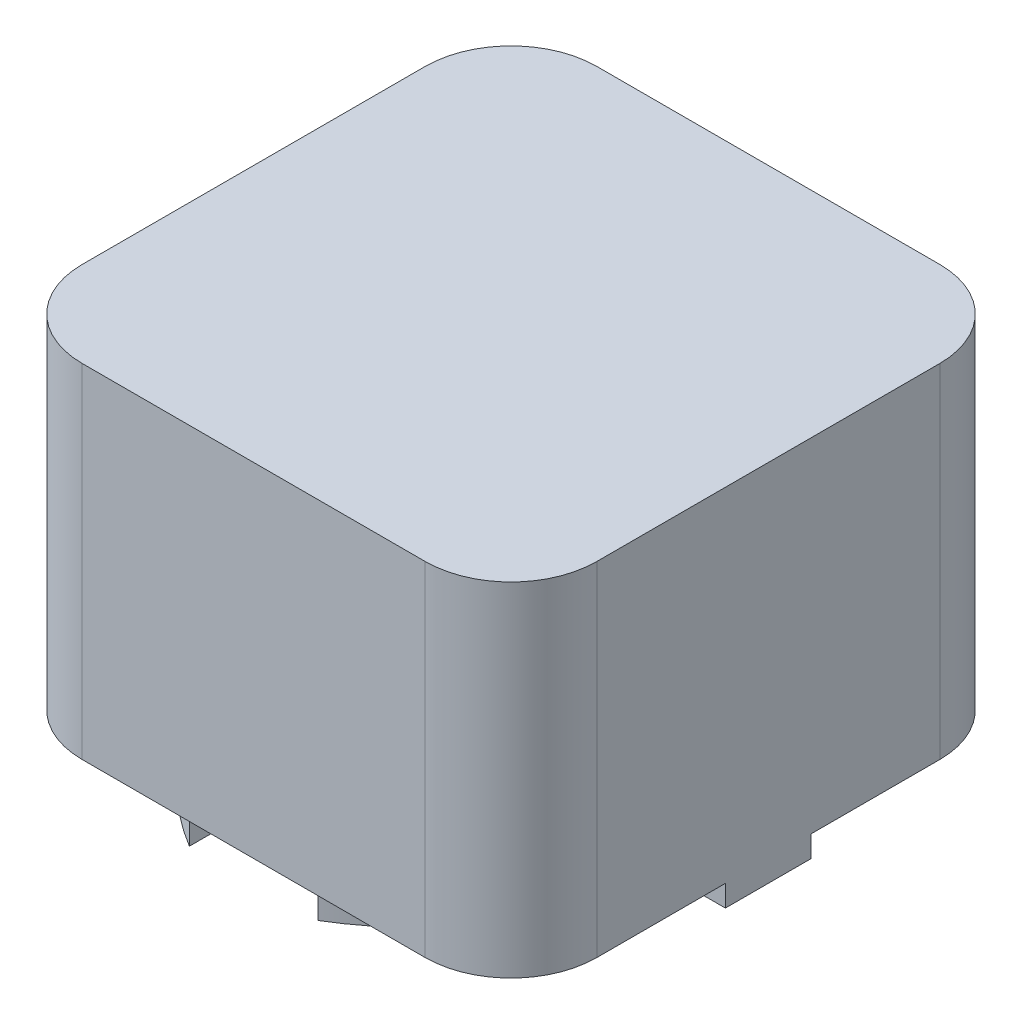
ISO-10303-21;
HEADER;
FILE_DESCRIPTION(('STEP AP214'),'2;1');
FILE_NAME('part.step','',(''),(''),'','','');
FILE_SCHEMA(('AUTOMOTIVE_DESIGN { 1 0 10303 214 1 1 1 1 }'));
ENDSEC;
DATA;
#1=APPLICATION_CONTEXT('core data for automotive mechanical design processes');
#2=APPLICATION_PROTOCOL_DEFINITION('international standard','automotive_design',2000,#1);
#3=PRODUCT_CONTEXT('',#1,'mechanical');
#4=PRODUCT('Part','Part','',(#3));
#5=PRODUCT_RELATED_PRODUCT_CATEGORY('part','',(#4));
#6=PRODUCT_DEFINITION_FORMATION('','',#4);
#7=PRODUCT_DEFINITION_CONTEXT('part definition',#1,'design');
#8=PRODUCT_DEFINITION('design','',#6,#7);
#9=PRODUCT_DEFINITION_SHAPE('','',#8);
#10=(LENGTH_UNIT() NAMED_UNIT(*) SI_UNIT(.MILLI.,.METRE.));
#11=(NAMED_UNIT(*) PLANE_ANGLE_UNIT() SI_UNIT($,.RADIAN.));
#12=(NAMED_UNIT(*) SI_UNIT($,.STERADIAN.) SOLID_ANGLE_UNIT());
#13=UNCERTAINTY_MEASURE_WITH_UNIT(LENGTH_MEASURE(1.E-05),#10,'distance_accuracy_value','');
#14=(GEOMETRIC_REPRESENTATION_CONTEXT(3) GLOBAL_UNCERTAINTY_ASSIGNED_CONTEXT((#13)) GLOBAL_UNIT_ASSIGNED_CONTEXT((#10,
#11,#12)) REPRESENTATION_CONTEXT('',''));
#15=CARTESIAN_POINT('',(0.,0.,0.));
#16=DIRECTION('',(0.,0.,1.));
#17=DIRECTION('',(1.,0.,0.));
#18=AXIS2_PLACEMENT_3D('',#15,#16,#17);
#19=CARTESIAN_POINT('',(0.,0.,0.));
#20=DIRECTION('',(0.,1.,0.));
#21=DIRECTION('',(0.,0.,1.));
#22=AXIS2_PLACEMENT_3D('',#19,#20,#21);
#23=PLANE('',#22);
#24=DIRECTION('',(-1.,0.,0.));
#25=VECTOR('',#24,1.);
#26=CARTESIAN_POINT('',(4.,0.,1.));
#27=LINE('',#26,#25);
#28=CARTESIAN_POINT('',(6.,0.,1.));
#29=VERTEX_POINT('',#28);
#30=CARTESIAN_POINT('',(4.82265195481152,0.,1.));
#31=VERTEX_POINT('',#30);
#32=EDGE_CURVE('E200',#29,#31,#27,.T.);
#33=ORIENTED_EDGE('',*,*,#32,.F.);
#34=DIRECTION('',(0.,0.,-1.));
#35=VECTOR('',#34,1.);
#36=CARTESIAN_POINT('',(6.,0.,-6.));
#37=LINE('',#36,#35);
#38=CARTESIAN_POINT('',(6.,0.,4.));
#39=VERTEX_POINT('',#38);
#40=EDGE_CURVE('E283',#39,#29,#37,.T.);
#41=ORIENTED_EDGE('',*,*,#40,.F.);
#42=CARTESIAN_POINT('',(4.,0.,4.));
#43=DIRECTION('',(0.,1.,0.));
#44=DIRECTION('',(0.,0.,1.));
#45=AXIS2_PLACEMENT_3D('',#42,#43,#44);
#46=CIRCLE('',#45,2.);
#47=CARTESIAN_POINT('',(4.,0.,6.));
#48=VERTEX_POINT('',#47);
#49=EDGE_CURVE('E301',#39,#48,#46,.F.);
#50=ORIENTED_EDGE('',*,*,#49,.T.);
#51=DIRECTION('',(1.,0.,0.));
#52=VECTOR('',#51,1.);
#53=CARTESIAN_POINT('',(-6.,0.,6.));
#54=LINE('',#53,#52);
#55=CARTESIAN_POINT('',(1.5,0.,6.));
#56=VERTEX_POINT('',#55);
#57=EDGE_CURVE('E278',#56,#48,#54,.T.);
#58=ORIENTED_EDGE('',*,*,#57,.F.);
#59=CARTESIAN_POINT('',(-2.10555127546399,0.,0.));
#60=DIRECTION('',(0.,-1.,0.));
#61=DIRECTION('',(0.,0.,1.));
#62=AXIS2_PLACEMENT_3D('',#59,#60,#61);
#63=CIRCLE('',#62,7.);
#64=EDGE_CURVE('E224',#31,#56,#63,.T.);
#65=ORIENTED_EDGE('',*,*,#64,.F.);
#66=EDGE_LOOP('',(#33,#41,#50,#58,#65));
#67=FACE_BOUND('',#66,.T.);
#68=ADVANCED_FACE('F37',(#67),#23,.F.);
#69=DIRECTION('',(1.,0.,0.));
#70=VECTOR('',#69,1.);
#71=CARTESIAN_POINT('',(4.,0.,-1.));
#72=LINE('',#71,#70);
#73=CARTESIAN_POINT('',(4.82265195481152,0.,-1.));
#74=VERTEX_POINT('',#73);
#75=CARTESIAN_POINT('',(6.,0.,-1.));
#76=VERTEX_POINT('',#75);
#77=EDGE_CURVE('E187',#74,#76,#72,.T.);
#78=ORIENTED_EDGE('',*,*,#77,.F.);
#79=CARTESIAN_POINT('',(1.5,0.,-6.));
#80=VERTEX_POINT('',#79);
#81=EDGE_CURVE('E230',#80,#74,#63,.T.);
#82=ORIENTED_EDGE('',*,*,#81,.F.);
#83=DIRECTION('',(-1.,0.,0.));
#84=VECTOR('',#83,1.);
#85=CARTESIAN_POINT('',(-6.,0.,-6.));
#86=LINE('',#85,#84);
#87=CARTESIAN_POINT('',(4.,0.,-6.));
#88=VERTEX_POINT('',#87);
#89=EDGE_CURVE('E265',#88,#80,#86,.T.);
#90=ORIENTED_EDGE('',*,*,#89,.F.);
#91=CARTESIAN_POINT('',(4.,0.,-4.));
#92=DIRECTION('',(0.,1.,0.));
#93=DIRECTION('',(0.,0.,1.));
#94=AXIS2_PLACEMENT_3D('',#91,#92,#93);
#95=CIRCLE('',#94,2.);
#96=CARTESIAN_POINT('',(6.,0.,-4.));
#97=VERTEX_POINT('',#96);
#98=EDGE_CURVE('E298',#88,#97,#95,.F.);
#99=ORIENTED_EDGE('',*,*,#98,.T.);
#100=EDGE_CURVE('E281',#76,#97,#37,.T.);
#101=ORIENTED_EDGE('',*,*,#100,.F.);
#102=EDGE_LOOP('',(#78,#82,#90,#99,#101));
#103=FACE_BOUND('',#102,.T.);
#104=ADVANCED_FACE('F375',(#103),#23,.F.);
#105=CARTESIAN_POINT('',(-2.10555127546399,-0.5,0.));
#106=DIRECTION('',(0.,1.,0.));
#107=DIRECTION('',(0.,0.,1.));
#108=AXIS2_PLACEMENT_3D('',#105,#106,#107);
#109=CYLINDRICAL_SURFACE('',#108,7.);
#110=DIRECTION('',(0.,1.,0.));
#111=VECTOR('',#110,1.);
#112=CARTESIAN_POINT('',(4.82265195481152,-0.5,1.));
#113=LINE('',#112,#111);
#114=CARTESIAN_POINT('',(4.82265195481152,-0.5,1.));
#115=VERTEX_POINT('',#114);
#116=EDGE_CURVE('E204',#31,#115,#113,.F.);
#117=ORIENTED_EDGE('',*,*,#116,.F.);
#118=ORIENTED_EDGE('',*,*,#64,.T.);
#119=DIRECTION('',(0.,1.,0.));
#120=VECTOR('',#119,1.);
#121=CARTESIAN_POINT('',(1.5,-0.5,6.));
#122=LINE('',#121,#120);
#123=CARTESIAN_POINT('',(1.5,-0.5,6.));
#124=VERTEX_POINT('',#123);
#125=EDGE_CURVE('E238',#124,#56,#122,.T.);
#126=ORIENTED_EDGE('',*,*,#125,.F.);
#127=CARTESIAN_POINT('',(-2.10555127546399,-0.5,0.));
#128=DIRECTION('',(0.,-1.,0.));
#129=DIRECTION('',(0.,0.,1.));
#130=AXIS2_PLACEMENT_3D('',#127,#128,#129);
#131=CIRCLE('',#130,7.);
#132=EDGE_CURVE('E227',#115,#124,#131,.T.);
#133=ORIENTED_EDGE('',*,*,#132,.F.);
#134=EDGE_LOOP('',(#117,#118,#126,#133));
#135=FACE_BOUND('',#134,.T.);
#136=ADVANCED_FACE('F385',(#135),#109,.T.);
#137=DIRECTION('',(0.,1.,0.));
#138=VECTOR('',#137,1.);
#139=CARTESIAN_POINT('',(4.82265195481152,-0.5,-1.));
#140=LINE('',#139,#138);
#141=CARTESIAN_POINT('',(4.82265195481152,-0.5,-1.));
#142=VERTEX_POINT('',#141);
#143=EDGE_CURVE('E190',#142,#74,#140,.T.);
#144=ORIENTED_EDGE('',*,*,#143,.F.);
#145=CARTESIAN_POINT('',(1.5,-0.5,-6.));
#146=VERTEX_POINT('',#145);
#147=EDGE_CURVE('E179',#146,#142,#131,.T.);
#148=ORIENTED_EDGE('',*,*,#147,.F.);
#149=DIRECTION('',(0.,1.,0.));
#150=VECTOR('',#149,1.);
#151=CARTESIAN_POINT('',(1.5,-0.5,-6.));
#152=LINE('',#151,#150);
#153=EDGE_CURVE('E229',#146,#80,#152,.T.);
#154=ORIENTED_EDGE('',*,*,#153,.T.);
#155=ORIENTED_EDGE('',*,*,#81,.T.);
#156=EDGE_LOOP('',(#144,#148,#154,#155));
#157=FACE_BOUND('',#156,.T.);
#158=ADVANCED_FACE('F382',(#157),#109,.T.);
#159=DIRECTION('',(1.,0.,0.));
#160=VECTOR('',#159,1.);
#161=CARTESIAN_POINT('',(-6.,0.,-1.));
#162=LINE('',#161,#160);
#163=CARTESIAN_POINT('',(-6.,0.,-1.));
#164=VERTEX_POINT('',#163);
#165=CARTESIAN_POINT('',(-4.82265195481152,0.,-1.));
#166=VERTEX_POINT('',#165);
#167=EDGE_CURVE('E206',#164,#166,#162,.T.);
#168=ORIENTED_EDGE('',*,*,#167,.F.);
#169=DIRECTION('',(0.,0.,1.));
#170=VECTOR('',#169,1.);
#171=CARTESIAN_POINT('',(-6.,0.,-6.));
#172=LINE('',#171,#170);
#173=CARTESIAN_POINT('',(-6.,0.,-4.));
#174=VERTEX_POINT('',#173);
#175=EDGE_CURVE('E275',#174,#164,#172,.T.);
#176=ORIENTED_EDGE('',*,*,#175,.F.);
#177=CARTESIAN_POINT('',(-4.,0.,-4.));
#178=DIRECTION('',(0.,1.,0.));
#179=DIRECTION('',(0.,0.,1.));
#180=AXIS2_PLACEMENT_3D('',#177,#178,#179);
#181=CIRCLE('',#180,2.);
#182=CARTESIAN_POINT('',(-4.,0.,-6.));
#183=VERTEX_POINT('',#182);
#184=EDGE_CURVE('E295',#174,#183,#181,.F.);
#185=ORIENTED_EDGE('',*,*,#184,.T.);
#186=CARTESIAN_POINT('',(-1.5,0.,-6.));
#187=VERTEX_POINT('',#186);
#188=EDGE_CURVE('E285',#187,#183,#86,.T.);
#189=ORIENTED_EDGE('',*,*,#188,.F.);
#190=CARTESIAN_POINT('',(2.10555127546399,0.,0.));
#191=DIRECTION('',(0.,-1.,0.));
#192=DIRECTION('',(0.,0.,1.));
#193=AXIS2_PLACEMENT_3D('',#190,#191,#192);
#194=CIRCLE('',#193,7.);
#195=EDGE_CURVE('E241',#166,#187,#194,.T.);
#196=ORIENTED_EDGE('',*,*,#195,.F.);
#197=EDGE_LOOP('',(#168,#176,#185,#189,#196));
#198=FACE_BOUND('',#197,.T.);
#199=ADVANCED_FACE('F384',(#198),#23,.F.);
#200=DIRECTION('',(-1.,0.,0.));
#201=VECTOR('',#200,1.);
#202=CARTESIAN_POINT('',(-6.,0.,1.));
#203=LINE('',#202,#201);
#204=CARTESIAN_POINT('',(-4.82265195481152,0.,1.));
#205=VERTEX_POINT('',#204);
#206=CARTESIAN_POINT('',(-6.,0.,1.));
#207=VERTEX_POINT('',#206);
#208=EDGE_CURVE('E209',#205,#207,#203,.T.);
#209=ORIENTED_EDGE('',*,*,#208,.F.);
#210=CARTESIAN_POINT('',(-1.5,0.,6.));
#211=VERTEX_POINT('',#210);
#212=EDGE_CURVE('E249',#211,#205,#194,.T.);
#213=ORIENTED_EDGE('',*,*,#212,.F.);
#214=CARTESIAN_POINT('',(-4.,0.,6.));
#215=VERTEX_POINT('',#214);
#216=EDGE_CURVE('E279',#215,#211,#54,.T.);
#217=ORIENTED_EDGE('',*,*,#216,.F.);
#218=CARTESIAN_POINT('',(-4.,0.,4.));
#219=DIRECTION('',(0.,1.,0.));
#220=DIRECTION('',(0.,0.,1.));
#221=AXIS2_PLACEMENT_3D('',#218,#219,#220);
#222=CIRCLE('',#221,2.);
#223=CARTESIAN_POINT('',(-6.,0.,4.));
#224=VERTEX_POINT('',#223);
#225=EDGE_CURVE('E292',#215,#224,#222,.F.);
#226=ORIENTED_EDGE('',*,*,#225,.T.);
#227=EDGE_CURVE('E260',#207,#224,#172,.T.);
#228=ORIENTED_EDGE('',*,*,#227,.F.);
#229=EDGE_LOOP('',(#209,#213,#217,#226,#228));
#230=FACE_BOUND('',#229,.T.);
#231=ADVANCED_FACE('F342',(#230),#23,.F.);
#232=CARTESIAN_POINT('',(2.10555127546399,-0.5,0.));
#233=DIRECTION('',(0.,1.,0.));
#234=DIRECTION('',(0.,0.,1.));
#235=AXIS2_PLACEMENT_3D('',#232,#233,#234);
#236=CYLINDRICAL_SURFACE('',#235,7.);
#237=DIRECTION('',(0.,1.,0.));
#238=VECTOR('',#237,1.);
#239=CARTESIAN_POINT('',(-4.82265195481152,-0.5,-1.));
#240=LINE('',#239,#238);
#241=CARTESIAN_POINT('',(-4.82265195481152,-0.5,-1.));
#242=VERTEX_POINT('',#241);
#243=EDGE_CURVE('E222',#166,#242,#240,.F.);
#244=ORIENTED_EDGE('',*,*,#243,.F.);
#245=ORIENTED_EDGE('',*,*,#195,.T.);
#246=DIRECTION('',(0.,1.,0.));
#247=VECTOR('',#246,1.);
#248=CARTESIAN_POINT('',(-1.5,-0.5,-6.));
#249=LINE('',#248,#247);
#250=CARTESIAN_POINT('',(-1.5,-0.5,-6.));
#251=VERTEX_POINT('',#250);
#252=EDGE_CURVE('E257',#251,#187,#249,.T.);
#253=ORIENTED_EDGE('',*,*,#252,.F.);
#254=CARTESIAN_POINT('',(2.10555127546399,-0.5,0.));
#255=DIRECTION('',(0.,-1.,0.));
#256=DIRECTION('',(0.,0.,1.));
#257=AXIS2_PLACEMENT_3D('',#254,#255,#256);
#258=CIRCLE('',#257,7.);
#259=EDGE_CURVE('E246',#242,#251,#258,.T.);
#260=ORIENTED_EDGE('',*,*,#259,.F.);
#261=EDGE_LOOP('',(#244,#245,#253,#260));
#262=FACE_BOUND('',#261,.T.);
#263=ADVANCED_FACE('F361',(#262),#236,.T.);
#264=DIRECTION('',(0.,1.,0.));
#265=VECTOR('',#264,1.);
#266=CARTESIAN_POINT('',(-4.82265195481152,-0.5,1.));
#267=LINE('',#266,#265);
#268=CARTESIAN_POINT('',(-4.82265195481152,-0.5,1.));
#269=VERTEX_POINT('',#268);
#270=EDGE_CURVE('E220',#269,#205,#267,.T.);
#271=ORIENTED_EDGE('',*,*,#270,.F.);
#272=CARTESIAN_POINT('',(-1.5,-0.5,6.));
#273=VERTEX_POINT('',#272);
#274=EDGE_CURVE('E242',#273,#269,#258,.T.);
#275=ORIENTED_EDGE('',*,*,#274,.F.);
#276=DIRECTION('',(0.,1.,0.));
#277=VECTOR('',#276,1.);
#278=CARTESIAN_POINT('',(-1.5,-0.5,6.));
#279=LINE('',#278,#277);
#280=EDGE_CURVE('E248',#273,#211,#279,.T.);
#281=ORIENTED_EDGE('',*,*,#280,.T.);
#282=ORIENTED_EDGE('',*,*,#212,.T.);
#283=EDGE_LOOP('',(#271,#275,#281,#282));
#284=FACE_BOUND('',#283,.T.);
#285=ADVANCED_FACE('F355',(#284),#236,.T.);
#286=DIRECTION('',(0.,0.,-1.));
#287=VECTOR('',#286,1.);
#288=CARTESIAN_POINT('',(1.5,0.,6.));
#289=LINE('',#288,#287);
#290=EDGE_CURVE('E233',#56,#80,#289,.T.);
#291=ORIENTED_EDGE('',*,*,#290,.F.);
#292=EDGE_CURVE('E282',#211,#56,#54,.T.);
#293=ORIENTED_EDGE('',*,*,#292,.F.);
#294=DIRECTION('',(0.,0.,1.));
#295=VECTOR('',#294,1.);
#296=CARTESIAN_POINT('',(-1.5,0.,6.));
#297=LINE('',#296,#295);
#298=EDGE_CURVE('E252',#187,#211,#297,.T.);
#299=ORIENTED_EDGE('',*,*,#298,.F.);
#300=EDGE_CURVE('E287',#80,#187,#86,.T.);
#301=ORIENTED_EDGE('',*,*,#300,.F.);
#302=EDGE_LOOP('',(#291,#293,#299,#301));
#303=FACE_BOUND('',#302,.T.);
#304=ADVANCED_FACE('F372',(#303),#23,.F.);
#305=CARTESIAN_POINT('',(-6.,8.,-6.));
#306=DIRECTION('',(1.,0.,0.));
#307=DIRECTION('',(0.,0.,-1.));
#308=AXIS2_PLACEMENT_3D('',#305,#306,#307);
#309=PLANE('',#308);
#310=DIRECTION('',(0.,0.,1.));
#311=VECTOR('',#310,1.);
#312=CARTESIAN_POINT('',(-6.,8.,-6.));
#313=LINE('',#312,#311);
#314=CARTESIAN_POINT('',(-6.,8.,-4.));
#315=VERTEX_POINT('',#314);
#316=CARTESIAN_POINT('',(-6.,8.,4.));
#317=VERTEX_POINT('',#316);
#318=EDGE_CURVE('E261',#315,#317,#313,.T.);
#319=ORIENTED_EDGE('',*,*,#318,.F.);
#320=DIRECTION('',(0.,-1.,0.));
#321=VECTOR('',#320,1.);
#322=CARTESIAN_POINT('',(-6.,8.,-4.));
#323=LINE('',#322,#321);
#324=EDGE_CURVE('E11',#315,#174,#323,.T.);
#325=ORIENTED_EDGE('',*,*,#324,.T.);
#326=ORIENTED_EDGE('',*,*,#175,.T.);
#327=DIRECTION('',(0.,1.,0.));
#328=VECTOR('',#327,1.);
#329=CARTESIAN_POINT('',(-6.,-0.5,-1.));
#330=LINE('',#329,#328);
#331=CARTESIAN_POINT('',(-6.,-0.5,-1.));
#332=VERTEX_POINT('',#331);
#333=EDGE_CURVE('E218',#332,#164,#330,.T.);
#334=ORIENTED_EDGE('',*,*,#333,.F.);
#335=DIRECTION('',(0.,0.,-1.));
#336=VECTOR('',#335,1.);
#337=CARTESIAN_POINT('',(-6.,-0.5,1.));
#338=LINE('',#337,#336);
#339=CARTESIAN_POINT('',(-6.,-0.5,1.));
#340=VERTEX_POINT('',#339);
#341=EDGE_CURVE('E207',#340,#332,#338,.T.);
#342=ORIENTED_EDGE('',*,*,#341,.F.);
#343=DIRECTION('',(0.,1.,0.));
#344=VECTOR('',#343,1.);
#345=CARTESIAN_POINT('',(-6.,-0.5,1.));
#346=LINE('',#345,#344);
#347=EDGE_CURVE('E213',#340,#207,#346,.T.);
#348=ORIENTED_EDGE('',*,*,#347,.T.);
#349=ORIENTED_EDGE('',*,*,#227,.T.);
#350=DIRECTION('',(0.,-1.,0.));
#351=VECTOR('',#350,1.);
#352=CARTESIAN_POINT('',(-6.,8.,4.));
#353=LINE('',#352,#351);
#354=EDGE_CURVE('E45',#224,#317,#353,.F.);
#355=ORIENTED_EDGE('',*,*,#354,.T.);
#356=EDGE_LOOP('',(#319,#325,#326,#334,#342,#348,#349,#355));
#357=FACE_BOUND('',#356,.T.);
#358=ADVANCED_FACE('F324',(#357),#309,.F.);
#359=CARTESIAN_POINT('',(-6.,8.,6.));
#360=DIRECTION('',(0.,0.,-1.));
#361=DIRECTION('',(-1.,0.,0.));
#362=AXIS2_PLACEMENT_3D('',#359,#360,#361);
#363=PLANE('',#362);
#364=ORIENTED_EDGE('',*,*,#216,.T.);
#365=ORIENTED_EDGE('',*,*,#292,.T.);
#366=ORIENTED_EDGE('',*,*,#57,.T.);
#367=DIRECTION('',(0.,-1.,0.));
#368=VECTOR('',#367,1.);
#369=CARTESIAN_POINT('',(4.,8.,6.));
#370=LINE('',#369,#368);
#371=CARTESIAN_POINT('',(4.,8.,6.));
#372=VERTEX_POINT('',#371);
#373=EDGE_CURVE('E307',#48,#372,#370,.F.);
#374=ORIENTED_EDGE('',*,*,#373,.T.);
#375=DIRECTION('',(1.,0.,0.));
#376=VECTOR('',#375,1.);
#377=CARTESIAN_POINT('',(-6.,8.,6.));
#378=LINE('',#377,#376);
#379=CARTESIAN_POINT('',(-4.,8.,6.));
#380=VERTEX_POINT('',#379);
#381=EDGE_CURVE('E264',#380,#372,#378,.T.);
#382=ORIENTED_EDGE('',*,*,#381,.F.);
#383=DIRECTION('',(0.,-1.,0.));
#384=VECTOR('',#383,1.);
#385=CARTESIAN_POINT('',(-4.,8.,6.));
#386=LINE('',#385,#384);
#387=EDGE_CURVE('E304',#380,#215,#386,.T.);
#388=ORIENTED_EDGE('',*,*,#387,.T.);
#389=EDGE_LOOP('',(#364,#365,#366,#374,#382,#388));
#390=FACE_BOUND('',#389,.T.);
#391=ADVANCED_FACE('F336',(#390),#363,.F.);
#392=CARTESIAN_POINT('',(6.,8.,-6.));
#393=DIRECTION('',(-1.,0.,0.));
#394=DIRECTION('',(0.,0.,1.));
#395=AXIS2_PLACEMENT_3D('',#392,#393,#394);
#396=PLANE('',#395);
#397=DIRECTION('',(0.,0.,-1.));
#398=VECTOR('',#397,1.);
#399=CARTESIAN_POINT('',(6.,8.,-6.));
#400=LINE('',#399,#398);
#401=CARTESIAN_POINT('',(6.,8.,4.));
#402=VERTEX_POINT('',#401);
#403=CARTESIAN_POINT('',(6.,8.,-4.));
#404=VERTEX_POINT('',#403);
#405=EDGE_CURVE('E268',#402,#404,#400,.T.);
#406=ORIENTED_EDGE('',*,*,#405,.F.);
#407=DIRECTION('',(0.,-1.,0.));
#408=VECTOR('',#407,1.);
#409=CARTESIAN_POINT('',(6.,8.,4.));
#410=LINE('',#409,#408);
#411=EDGE_CURVE('E289',#402,#39,#410,.T.);
#412=ORIENTED_EDGE('',*,*,#411,.T.);
#413=ORIENTED_EDGE('',*,*,#40,.T.);
#414=DIRECTION('',(0.,1.,0.));
#415=VECTOR('',#414,1.);
#416=CARTESIAN_POINT('',(6.,-0.5,1.));
#417=LINE('',#416,#415);
#418=CARTESIAN_POINT('',(6.,-0.5,1.));
#419=VERTEX_POINT('',#418);
#420=EDGE_CURVE('E191',#419,#29,#417,.T.);
#421=ORIENTED_EDGE('',*,*,#420,.F.);
#422=DIRECTION('',(0.,0.,1.));
#423=VECTOR('',#422,1.);
#424=CARTESIAN_POINT('',(6.,-0.5,1.));
#425=LINE('',#424,#423);
#426=CARTESIAN_POINT('',(6.,-0.5,-1.));
#427=VERTEX_POINT('',#426);
#428=EDGE_CURVE('E176',#427,#419,#425,.T.);
#429=ORIENTED_EDGE('',*,*,#428,.F.);
#430=DIRECTION('',(0.,1.,0.));
#431=VECTOR('',#430,1.);
#432=CARTESIAN_POINT('',(6.,-0.5,-1.));
#433=LINE('',#432,#431);
#434=EDGE_CURVE('E184',#427,#76,#433,.T.);
#435=ORIENTED_EDGE('',*,*,#434,.T.);
#436=ORIENTED_EDGE('',*,*,#100,.T.);
#437=DIRECTION('',(0.,-1.,0.));
#438=VECTOR('',#437,1.);
#439=CARTESIAN_POINT('',(6.,8.,-4.));
#440=LINE('',#439,#438);
#441=EDGE_CURVE('E274',#97,#404,#440,.F.);
#442=ORIENTED_EDGE('',*,*,#441,.T.);
#443=EDGE_LOOP('',(#406,#412,#413,#421,#429,#435,#436,#442));
#444=FACE_BOUND('',#443,.T.);
#445=ADVANCED_FACE('F194',(#444),#396,.F.);
#446=CARTESIAN_POINT('',(-6.,8.,-6.));
#447=DIRECTION('',(0.,0.,1.));
#448=DIRECTION('',(1.,0.,0.));
#449=AXIS2_PLACEMENT_3D('',#446,#447,#448);
#450=PLANE('',#449);
#451=DIRECTION('',(-1.,0.,0.));
#452=VECTOR('',#451,1.);
#453=CARTESIAN_POINT('',(-6.,8.,-6.));
#454=LINE('',#453,#452);
#455=CARTESIAN_POINT('',(4.,8.,-6.));
#456=VERTEX_POINT('',#455);
#457=CARTESIAN_POINT('',(-4.,8.,-6.));
#458=VERTEX_POINT('',#457);
#459=EDGE_CURVE('E271',#456,#458,#454,.T.);
#460=ORIENTED_EDGE('',*,*,#459,.F.);
#461=DIRECTION('',(0.,-1.,0.));
#462=VECTOR('',#461,1.);
#463=CARTESIAN_POINT('',(4.,8.,-6.));
#464=LINE('',#463,#462);
#465=EDGE_CURVE('E319',#456,#88,#464,.T.);
#466=ORIENTED_EDGE('',*,*,#465,.T.);
#467=ORIENTED_EDGE('',*,*,#89,.T.);
#468=ORIENTED_EDGE('',*,*,#300,.T.);
#469=ORIENTED_EDGE('',*,*,#188,.T.);
#470=DIRECTION('',(0.,-1.,0.));
#471=VECTOR('',#470,1.);
#472=CARTESIAN_POINT('',(-4.,8.,-6.));
#473=LINE('',#472,#471);
#474=EDGE_CURVE('E317',#183,#458,#473,.F.);
#475=ORIENTED_EDGE('',*,*,#474,.T.);
#476=EDGE_LOOP('',(#460,#466,#467,#468,#469,#475));
#477=FACE_BOUND('',#476,.T.);
#478=ADVANCED_FACE('F368',(#477),#450,.F.);
#479=CARTESIAN_POINT('',(0.,8.,0.));
#480=DIRECTION('',(0.,1.,0.));
#481=DIRECTION('',(0.,0.,1.));
#482=AXIS2_PLACEMENT_3D('',#479,#480,#481);
#483=PLANE('',#482);
#484=ORIENTED_EDGE('',*,*,#381,.T.);
#485=CARTESIAN_POINT('',(4.,8.,4.));
#486=DIRECTION('',(0.,1.,0.));
#487=DIRECTION('',(0.,0.,1.));
#488=AXIS2_PLACEMENT_3D('',#485,#486,#487);
#489=CIRCLE('',#488,2.);
#490=EDGE_CURVE('E315',#372,#402,#489,.T.);
#491=ORIENTED_EDGE('',*,*,#490,.T.);
#492=ORIENTED_EDGE('',*,*,#405,.T.);
#493=CARTESIAN_POINT('',(4.,8.,-4.));
#494=DIRECTION('',(0.,1.,0.));
#495=DIRECTION('',(0.,0.,1.));
#496=AXIS2_PLACEMENT_3D('',#493,#494,#495);
#497=CIRCLE('',#496,2.);
#498=EDGE_CURVE('E313',#404,#456,#497,.T.);
#499=ORIENTED_EDGE('',*,*,#498,.T.);
#500=ORIENTED_EDGE('',*,*,#459,.T.);
#501=CARTESIAN_POINT('',(-4.,8.,-4.));
#502=DIRECTION('',(0.,1.,0.));
#503=DIRECTION('',(0.,0.,1.));
#504=AXIS2_PLACEMENT_3D('',#501,#502,#503);
#505=CIRCLE('',#504,2.);
#506=EDGE_CURVE('E311',#458,#315,#505,.T.);
#507=ORIENTED_EDGE('',*,*,#506,.T.);
#508=ORIENTED_EDGE('',*,*,#318,.T.);
#509=CARTESIAN_POINT('',(-4.,8.,4.));
#510=DIRECTION('',(0.,1.,0.));
#511=DIRECTION('',(0.,0.,1.));
#512=AXIS2_PLACEMENT_3D('',#509,#510,#511);
#513=CIRCLE('',#512,2.);
#514=EDGE_CURVE('E309',#317,#380,#513,.T.);
#515=ORIENTED_EDGE('',*,*,#514,.T.);
#516=EDGE_LOOP('',(#484,#491,#492,#499,#500,#507,#508,#515));
#517=FACE_BOUND('',#516,.T.);
#518=ADVANCED_FACE('F330',(#517),#483,.T.);
#519=CARTESIAN_POINT('',(4.,8.,4.));
#520=DIRECTION('',(0.,-1.,0.));
#521=DIRECTION('',(0.,0.,-1.));
#522=AXIS2_PLACEMENT_3D('',#519,#520,#521);
#523=CYLINDRICAL_SURFACE('',#522,2.);
#524=ORIENTED_EDGE('',*,*,#490,.F.);
#525=ORIENTED_EDGE('',*,*,#373,.F.);
#526=ORIENTED_EDGE('',*,*,#49,.F.);
#527=ORIENTED_EDGE('',*,*,#411,.F.);
#528=EDGE_LOOP('',(#524,#525,#526,#527));
#529=FACE_BOUND('',#528,.T.);
#530=ADVANCED_FACE('F412',(#529),#523,.T.);
#531=CARTESIAN_POINT('',(4.,8.,-4.));
#532=DIRECTION('',(0.,-1.,0.));
#533=DIRECTION('',(0.,0.,-1.));
#534=AXIS2_PLACEMENT_3D('',#531,#532,#533);
#535=CYLINDRICAL_SURFACE('',#534,2.);
#536=ORIENTED_EDGE('',*,*,#498,.F.);
#537=ORIENTED_EDGE('',*,*,#441,.F.);
#538=ORIENTED_EDGE('',*,*,#98,.F.);
#539=ORIENTED_EDGE('',*,*,#465,.F.);
#540=EDGE_LOOP('',(#536,#537,#538,#539));
#541=FACE_BOUND('',#540,.T.);
#542=ADVANCED_FACE('F415',(#541),#535,.T.);
#543=CARTESIAN_POINT('',(-4.,8.,-4.));
#544=DIRECTION('',(0.,-1.,0.));
#545=DIRECTION('',(0.,0.,-1.));
#546=AXIS2_PLACEMENT_3D('',#543,#544,#545);
#547=CYLINDRICAL_SURFACE('',#546,2.);
#548=ORIENTED_EDGE('',*,*,#506,.F.);
#549=ORIENTED_EDGE('',*,*,#474,.F.);
#550=ORIENTED_EDGE('',*,*,#184,.F.);
#551=ORIENTED_EDGE('',*,*,#324,.F.);
#552=EDGE_LOOP('',(#548,#549,#550,#551));
#553=FACE_BOUND('',#552,.T.);
#554=ADVANCED_FACE('F418',(#553),#547,.T.);
#555=CARTESIAN_POINT('',(-4.,8.,4.));
#556=DIRECTION('',(0.,-1.,0.));
#557=DIRECTION('',(0.,0.,-1.));
#558=AXIS2_PLACEMENT_3D('',#555,#556,#557);
#559=CYLINDRICAL_SURFACE('',#558,2.);
#560=ORIENTED_EDGE('',*,*,#514,.F.);
#561=ORIENTED_EDGE('',*,*,#354,.F.);
#562=ORIENTED_EDGE('',*,*,#225,.F.);
#563=ORIENTED_EDGE('',*,*,#387,.F.);
#564=EDGE_LOOP('',(#560,#561,#562,#563));
#565=FACE_BOUND('',#564,.T.);
#566=ADVANCED_FACE('F39',(#565),#559,.T.);
#567=CARTESIAN_POINT('',(-1.5,-0.5,6.));
#568=DIRECTION('',(-1.,0.,0.));
#569=DIRECTION('',(0.,0.,1.));
#570=AXIS2_PLACEMENT_3D('',#567,#568,#569);
#571=PLANE('',#570);
#572=ORIENTED_EDGE('',*,*,#298,.T.);
#573=ORIENTED_EDGE('',*,*,#280,.F.);
#574=DIRECTION('',(0.,0.,1.));
#575=VECTOR('',#574,1.);
#576=CARTESIAN_POINT('',(-1.5,-0.5,6.));
#577=LINE('',#576,#575);
#578=EDGE_CURVE('E245',#251,#273,#577,.T.);
#579=ORIENTED_EDGE('',*,*,#578,.F.);
#580=ORIENTED_EDGE('',*,*,#252,.T.);
#581=EDGE_LOOP('',(#572,#573,#579,#580));
#582=FACE_BOUND('',#581,.T.);
#583=ADVANCED_FACE('F348',(#582),#571,.F.);
#584=CARTESIAN_POINT('',(2.10555127546399,-0.5,0.));
#585=DIRECTION('',(0.,1.,0.));
#586=DIRECTION('',(0.,0.,1.));
#587=AXIS2_PLACEMENT_3D('',#584,#585,#586);
#588=PLANE('',#587);
#589=ORIENTED_EDGE('',*,*,#274,.T.);
#590=DIRECTION('',(-1.,0.,0.));
#591=VECTOR('',#590,1.);
#592=CARTESIAN_POINT('',(-6.,-0.5,1.));
#593=LINE('',#592,#591);
#594=EDGE_CURVE('E211',#269,#340,#593,.T.);
#595=ORIENTED_EDGE('',*,*,#594,.T.);
#596=ORIENTED_EDGE('',*,*,#341,.T.);
#597=DIRECTION('',(1.,0.,0.));
#598=VECTOR('',#597,1.);
#599=CARTESIAN_POINT('',(-6.,-0.5,-1.));
#600=LINE('',#599,#598);
#601=EDGE_CURVE('E60',#332,#242,#600,.T.);
#602=ORIENTED_EDGE('',*,*,#601,.T.);
#603=ORIENTED_EDGE('',*,*,#259,.T.);
#604=ORIENTED_EDGE('',*,*,#578,.T.);
#605=EDGE_LOOP('',(#589,#595,#596,#602,#603,#604));
#606=FACE_BOUND('',#605,.T.);
#607=ADVANCED_FACE('F356',(#606),#588,.F.);
#608=CARTESIAN_POINT('',(1.5,-0.5,6.));
#609=DIRECTION('',(1.,0.,0.));
#610=DIRECTION('',(0.,0.,-1.));
#611=AXIS2_PLACEMENT_3D('',#608,#609,#610);
#612=PLANE('',#611);
#613=ORIENTED_EDGE('',*,*,#290,.T.);
#614=ORIENTED_EDGE('',*,*,#153,.F.);
#615=DIRECTION('',(0.,0.,-1.));
#616=VECTOR('',#615,1.);
#617=CARTESIAN_POINT('',(1.5,-0.5,6.));
#618=LINE('',#617,#616);
#619=EDGE_CURVE('E226',#124,#146,#618,.T.);
#620=ORIENTED_EDGE('',*,*,#619,.F.);
#621=ORIENTED_EDGE('',*,*,#125,.T.);
#622=EDGE_LOOP('',(#613,#614,#620,#621));
#623=FACE_BOUND('',#622,.T.);
#624=ADVANCED_FACE('F379',(#623),#612,.F.);
#625=CARTESIAN_POINT('',(-2.10555127546399,-0.5,0.));
#626=DIRECTION('',(0.,1.,0.));
#627=DIRECTION('',(0.,0.,1.));
#628=AXIS2_PLACEMENT_3D('',#625,#626,#627);
#629=PLANE('',#628);
#630=ORIENTED_EDGE('',*,*,#147,.T.);
#631=DIRECTION('',(1.,0.,0.));
#632=VECTOR('',#631,1.);
#633=CARTESIAN_POINT('',(4.,-0.5,-1.));
#634=LINE('',#633,#632);
#635=EDGE_CURVE('E172',#142,#427,#634,.T.);
#636=ORIENTED_EDGE('',*,*,#635,.T.);
#637=ORIENTED_EDGE('',*,*,#428,.T.);
#638=DIRECTION('',(-1.,0.,0.));
#639=VECTOR('',#638,1.);
#640=CARTESIAN_POINT('',(4.,-0.5,1.));
#641=LINE('',#640,#639);
#642=EDGE_CURVE('E52',#419,#115,#641,.T.);
#643=ORIENTED_EDGE('',*,*,#642,.T.);
#644=ORIENTED_EDGE('',*,*,#132,.T.);
#645=ORIENTED_EDGE('',*,*,#619,.T.);
#646=EDGE_LOOP('',(#630,#636,#637,#643,#644,#645));
#647=FACE_BOUND('',#646,.T.);
#648=ADVANCED_FACE('F174',(#647),#629,.F.);
#649=CARTESIAN_POINT('',(-6.,-0.5,-1.));
#650=DIRECTION('',(0.,0.,1.));
#651=DIRECTION('',(1.,0.,0.));
#652=AXIS2_PLACEMENT_3D('',#649,#650,#651);
#653=PLANE('',#652);
#654=ORIENTED_EDGE('',*,*,#167,.T.);
#655=ORIENTED_EDGE('',*,*,#243,.T.);
#656=ORIENTED_EDGE('',*,*,#601,.F.);
#657=ORIENTED_EDGE('',*,*,#333,.T.);
#658=EDGE_LOOP('',(#654,#655,#656,#657));
#659=FACE_BOUND('',#658,.T.);
#660=ADVANCED_FACE('F429',(#659),#653,.F.);
#661=CARTESIAN_POINT('',(-6.,-0.5,1.));
#662=DIRECTION('',(0.,0.,-1.));
#663=DIRECTION('',(-1.,0.,0.));
#664=AXIS2_PLACEMENT_3D('',#661,#662,#663);
#665=PLANE('',#664);
#666=ORIENTED_EDGE('',*,*,#594,.F.);
#667=ORIENTED_EDGE('',*,*,#270,.T.);
#668=ORIENTED_EDGE('',*,*,#208,.T.);
#669=ORIENTED_EDGE('',*,*,#347,.F.);
#670=EDGE_LOOP('',(#666,#667,#668,#669));
#671=FACE_BOUND('',#670,.T.);
#672=ADVANCED_FACE('F432',(#671),#665,.F.);
#673=CARTESIAN_POINT('',(4.,-0.5,1.));
#674=DIRECTION('',(0.,0.,-1.));
#675=DIRECTION('',(-1.,0.,0.));
#676=AXIS2_PLACEMENT_3D('',#673,#674,#675);
#677=PLANE('',#676);
#678=ORIENTED_EDGE('',*,*,#32,.T.);
#679=ORIENTED_EDGE('',*,*,#116,.T.);
#680=ORIENTED_EDGE('',*,*,#642,.F.);
#681=ORIENTED_EDGE('',*,*,#420,.T.);
#682=EDGE_LOOP('',(#678,#679,#680,#681));
#683=FACE_BOUND('',#682,.T.);
#684=ADVANCED_FACE('F434',(#683),#677,.F.);
#685=CARTESIAN_POINT('',(4.,-0.5,-1.));
#686=DIRECTION('',(0.,0.,1.));
#687=DIRECTION('',(1.,0.,0.));
#688=AXIS2_PLACEMENT_3D('',#685,#686,#687);
#689=PLANE('',#688);
#690=ORIENTED_EDGE('',*,*,#635,.F.);
#691=ORIENTED_EDGE('',*,*,#143,.T.);
#692=ORIENTED_EDGE('',*,*,#77,.T.);
#693=ORIENTED_EDGE('',*,*,#434,.F.);
#694=EDGE_LOOP('',(#690,#691,#692,#693));
#695=FACE_BOUND('',#694,.T.);
#696=ADVANCED_FACE('F185',(#695),#689,.F.);
#697=CLOSED_SHELL('',(#68,#104,#136,#158,#199,#231,#263,#285,#304,#358,#391,#445,#478,#518,#530,
#542,#554,#566,#583,#607,#624,#648,#660,#672,#684,#696));
#698=MANIFOLD_SOLID_BREP('B2',#697);
#699=ADVANCED_BREP_SHAPE_REPRESENTATION('',(#18,#698),#14);
#700=SHAPE_DEFINITION_REPRESENTATION(#9,#699);
ENDSEC;
END-ISO-10303-21;
